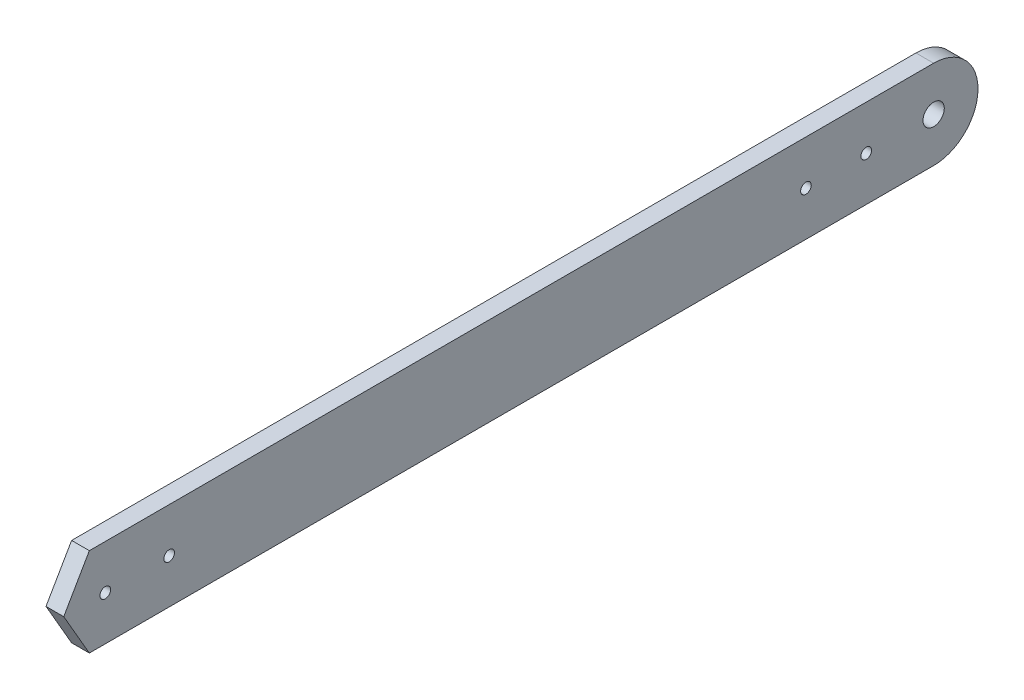
ISO-10303-21;
HEADER;
FILE_DESCRIPTION(('STEP AP214'),'2;1');
FILE_NAME('part.step','',(''),(''),'','','');
FILE_SCHEMA(('AUTOMOTIVE_DESIGN { 1 0 10303 214 1 1 1 1 }'));
ENDSEC;
DATA;
#1=APPLICATION_CONTEXT('core data for automotive mechanical design processes');
#2=APPLICATION_PROTOCOL_DEFINITION('international standard','automotive_design',2000,#1);
#3=PRODUCT_CONTEXT('',#1,'mechanical');
#4=PRODUCT('Part','Part','',(#3));
#5=PRODUCT_RELATED_PRODUCT_CATEGORY('part','',(#4));
#6=PRODUCT_DEFINITION_FORMATION('','',#4);
#7=PRODUCT_DEFINITION_CONTEXT('part definition',#1,'design');
#8=PRODUCT_DEFINITION('design','',#6,#7);
#9=PRODUCT_DEFINITION_SHAPE('','',#8);
#10=(LENGTH_UNIT() NAMED_UNIT(*) SI_UNIT(.MILLI.,.METRE.));
#11=(NAMED_UNIT(*) PLANE_ANGLE_UNIT() SI_UNIT($,.RADIAN.));
#12=(NAMED_UNIT(*) SI_UNIT($,.STERADIAN.) SOLID_ANGLE_UNIT());
#13=UNCERTAINTY_MEASURE_WITH_UNIT(LENGTH_MEASURE(1.E-05),#10,'distance_accuracy_value','');
#14=(GEOMETRIC_REPRESENTATION_CONTEXT(3) GLOBAL_UNCERTAINTY_ASSIGNED_CONTEXT((#13)) GLOBAL_UNIT_ASSIGNED_CONTEXT((#10,
#11,#12)) REPRESENTATION_CONTEXT('',''));
#15=CARTESIAN_POINT('',(0.,0.,0.));
#16=DIRECTION('',(0.,0.,1.));
#17=DIRECTION('',(1.,0.,0.));
#18=AXIS2_PLACEMENT_3D('',#15,#16,#17);
#19=CARTESIAN_POINT('',(-2.5,-12.5,258.5));
#20=DIRECTION('',(0.,1.,0.));
#21=DIRECTION('',(0.,0.,1.));
#22=AXIS2_PLACEMENT_3D('',#19,#20,#21);
#23=PLANE('',#22);
#24=DIRECTION('',(1.,0.,0.));
#25=VECTOR('',#24,1.);
#26=CARTESIAN_POINT('',(-2.5,-12.5,12.5));
#27=LINE('',#26,#25);
#28=CARTESIAN_POINT('',(-2.5,-12.5,12.5));
#29=VERTEX_POINT('',#28);
#30=CARTESIAN_POINT('',(2.5,-12.5,12.5));
#31=VERTEX_POINT('',#30);
#32=EDGE_CURVE('E100',#29,#31,#27,.T.);
#33=ORIENTED_EDGE('',*,*,#32,.T.);
#34=DIRECTION('',(0.,0.,-1.));
#35=VECTOR('',#34,1.);
#36=CARTESIAN_POINT('',(2.5,-12.5,258.5));
#37=LINE('',#36,#35);
#38=CARTESIAN_POINT('',(2.5,-12.5,250.5));
#39=VERTEX_POINT('',#38);
#40=EDGE_CURVE('E95',#39,#31,#37,.T.);
#41=ORIENTED_EDGE('',*,*,#40,.F.);
#42=DIRECTION('',(1.,0.,0.));
#43=VECTOR('',#42,1.);
#44=CARTESIAN_POINT('',(-2.5,-12.5,250.5));
#45=LINE('',#44,#43);
#46=CARTESIAN_POINT('',(-2.5,-12.5,250.5));
#47=VERTEX_POINT('',#46);
#48=EDGE_CURVE('E82',#47,#39,#45,.T.);
#49=ORIENTED_EDGE('',*,*,#48,.F.);
#50=DIRECTION('',(0.,0.,-1.));
#51=VECTOR('',#50,1.);
#52=CARTESIAN_POINT('',(-2.5,-12.5,258.5));
#53=LINE('',#52,#51);
#54=EDGE_CURVE('E101',#47,#29,#53,.T.);
#55=ORIENTED_EDGE('',*,*,#54,.T.);
#56=EDGE_LOOP('',(#33,#41,#49,#55));
#57=FACE_BOUND('',#56,.T.);
#58=ADVANCED_FACE('F37',(#57),#23,.F.);
#59=CARTESIAN_POINT('',(2.5,-12.5,258.5));
#60=DIRECTION('',(-1.,0.,0.));
#61=DIRECTION('',(0.,0.,1.));
#62=AXIS2_PLACEMENT_3D('',#59,#60,#61);
#63=PLANE('',#62);
#64=CARTESIAN_POINT('',(2.5,0.,228.));
#65=DIRECTION('',(1.,0.,0.));
#66=DIRECTION('',(0.,0.,-1.));
#67=AXIS2_PLACEMENT_3D('',#64,#65,#66);
#68=CIRCLE('',#67,1.50000000000003);
#69=CARTESIAN_POINT('',(2.5,0.,226.5));
#70=VERTEX_POINT('',#69);
#71=EDGE_CURVE('E139',#70,#70,#68,.T.);
#72=ORIENTED_EDGE('',*,*,#71,.F.);
#73=EDGE_LOOP('',(#72));
#74=FACE_BOUND('',#73,.T.);
#75=CARTESIAN_POINT('',(2.5,0.,246.));
#76=DIRECTION('',(1.,0.,0.));
#77=DIRECTION('',(0.,0.,-1.));
#78=AXIS2_PLACEMENT_3D('',#75,#76,#77);
#79=CIRCLE('',#78,1.50000000000003);
#80=CARTESIAN_POINT('',(2.5,0.,244.5));
#81=VERTEX_POINT('',#80);
#82=EDGE_CURVE('E133',#81,#81,#79,.T.);
#83=ORIENTED_EDGE('',*,*,#82,.F.);
#84=EDGE_LOOP('',(#83));
#85=FACE_BOUND('',#84,.T.);
#86=CARTESIAN_POINT('',(2.5,0.,48.5));
#87=DIRECTION('',(1.,0.,0.));
#88=DIRECTION('',(0.,0.,-1.));
#89=AXIS2_PLACEMENT_3D('',#86,#87,#88);
#90=CIRCLE('',#89,1.5);
#91=CARTESIAN_POINT('',(2.5,0.,47.));
#92=VERTEX_POINT('',#91);
#93=EDGE_CURVE('E123',#92,#92,#90,.T.);
#94=ORIENTED_EDGE('',*,*,#93,.F.);
#95=EDGE_LOOP('',(#94));
#96=FACE_BOUND('',#95,.T.);
#97=CARTESIAN_POINT('',(2.5,0.,31.5));
#98=DIRECTION('',(1.,0.,0.));
#99=DIRECTION('',(0.,0.,-1.));
#100=AXIS2_PLACEMENT_3D('',#97,#98,#99);
#101=CIRCLE('',#100,1.5);
#102=CARTESIAN_POINT('',(2.5,0.,30.));
#103=VERTEX_POINT('',#102);
#104=EDGE_CURVE('E163',#103,#103,#101,.T.);
#105=ORIENTED_EDGE('',*,*,#104,.F.);
#106=EDGE_LOOP('',(#105));
#107=FACE_BOUND('',#106,.T.);
#108=CARTESIAN_POINT('',(2.5,0.,12.5));
#109=DIRECTION('',(1.,0.,0.));
#110=DIRECTION('',(0.,0.,-1.));
#111=AXIS2_PLACEMENT_3D('',#108,#109,#110);
#112=CIRCLE('',#111,3.);
#113=CARTESIAN_POINT('',(2.5,0.,9.50000000000001));
#114=VERTEX_POINT('',#113);
#115=EDGE_CURVE('E106',#114,#114,#112,.T.);
#116=ORIENTED_EDGE('',*,*,#115,.F.);
#117=EDGE_LOOP('',(#116));
#118=FACE_BOUND('',#117,.T.);
#119=ORIENTED_EDGE('',*,*,#40,.T.);
#120=CARTESIAN_POINT('',(2.5,0.,12.5));
#121=DIRECTION('',(-1.,0.,0.));
#122=DIRECTION('',(0.,0.,-1.));
#123=AXIS2_PLACEMENT_3D('',#120,#121,#122);
#124=CIRCLE('',#123,12.5);
#125=CARTESIAN_POINT('',(2.5,12.5,12.5));
#126=VERTEX_POINT('',#125);
#127=EDGE_CURVE('E60',#126,#31,#124,.T.);
#128=ORIENTED_EDGE('',*,*,#127,.F.);
#129=DIRECTION('',(0.,0.,-1.));
#130=VECTOR('',#129,1.);
#131=CARTESIAN_POINT('',(2.5,12.5,258.5));
#132=LINE('',#131,#130);
#133=CARTESIAN_POINT('',(2.5,12.5,250.5));
#134=VERTEX_POINT('',#133);
#135=EDGE_CURVE('E11',#134,#126,#132,.T.);
#136=ORIENTED_EDGE('',*,*,#135,.F.);
#137=DIRECTION('',(0.,0.866025403784438,-0.500000000000001));
#138=VECTOR('',#137,1.);
#139=CARTESIAN_POINT('',(2.5,0.,257.71687836487));
#140=LINE('',#139,#138);
#141=CARTESIAN_POINT('',(2.5,0.,257.71687836487));
#142=VERTEX_POINT('',#141);
#143=EDGE_CURVE('E97',#142,#134,#140,.T.);
#144=ORIENTED_EDGE('',*,*,#143,.F.);
#145=DIRECTION('',(0.,0.866025403784438,0.500000000000001));
#146=VECTOR('',#145,1.);
#147=CARTESIAN_POINT('',(2.5,-12.5,250.5));
#148=LINE('',#147,#146);
#149=EDGE_CURVE('E85',#39,#142,#148,.T.);
#150=ORIENTED_EDGE('',*,*,#149,.F.);
#151=EDGE_LOOP('',(#119,#128,#136,#144,#150));
#152=FACE_BOUND('',#151,.T.);
#153=ADVANCED_FACE('F39',(#74,#85,#96,#107,#118,#152),#63,.F.);
#154=CARTESIAN_POINT('',(-2.5,12.5,258.5));
#155=DIRECTION('',(0.,-1.,0.));
#156=DIRECTION('',(0.,0.,-1.));
#157=AXIS2_PLACEMENT_3D('',#154,#155,#156);
#158=PLANE('',#157);
#159=ORIENTED_EDGE('',*,*,#135,.T.);
#160=DIRECTION('',(1.,0.,0.));
#161=VECTOR('',#160,1.);
#162=CARTESIAN_POINT('',(-2.5,12.5,12.5));
#163=LINE('',#162,#161);
#164=CARTESIAN_POINT('',(-2.5,12.5,12.5));
#165=VERTEX_POINT('',#164);
#166=EDGE_CURVE('E122',#165,#126,#163,.T.);
#167=ORIENTED_EDGE('',*,*,#166,.F.);
#168=DIRECTION('',(0.,0.,-1.));
#169=VECTOR('',#168,1.);
#170=CARTESIAN_POINT('',(-2.5,12.5,258.5));
#171=LINE('',#170,#169);
#172=CARTESIAN_POINT('',(-2.5,12.5,250.5));
#173=VERTEX_POINT('',#172);
#174=EDGE_CURVE('E45',#173,#165,#171,.T.);
#175=ORIENTED_EDGE('',*,*,#174,.F.);
#176=DIRECTION('',(1.,0.,0.));
#177=VECTOR('',#176,1.);
#178=CARTESIAN_POINT('',(-2.5,12.5,250.5));
#179=LINE('',#178,#177);
#180=EDGE_CURVE('E91',#173,#134,#179,.T.);
#181=ORIENTED_EDGE('',*,*,#180,.T.);
#182=EDGE_LOOP('',(#159,#167,#175,#181));
#183=FACE_BOUND('',#182,.T.);
#184=ADVANCED_FACE('F121',(#183),#158,.F.);
#185=CARTESIAN_POINT('',(-2.5,-12.5,258.5));
#186=DIRECTION('',(1.,0.,0.));
#187=DIRECTION('',(0.,0.,-1.));
#188=AXIS2_PLACEMENT_3D('',#185,#186,#187);
#189=PLANE('',#188);
#190=CARTESIAN_POINT('',(-2.5,0.,228.));
#191=DIRECTION('',(1.,0.,0.));
#192=DIRECTION('',(0.,0.,-1.));
#193=AXIS2_PLACEMENT_3D('',#190,#191,#192);
#194=CIRCLE('',#193,1.50000000000003);
#195=CARTESIAN_POINT('',(-2.5,0.,226.5));
#196=VERTEX_POINT('',#195);
#197=EDGE_CURVE('E98',#196,#196,#194,.T.);
#198=ORIENTED_EDGE('',*,*,#197,.T.);
#199=EDGE_LOOP('',(#198));
#200=FACE_BOUND('',#199,.T.);
#201=CARTESIAN_POINT('',(-2.5,0.,246.));
#202=DIRECTION('',(1.,0.,0.));
#203=DIRECTION('',(0.,0.,-1.));
#204=AXIS2_PLACEMENT_3D('',#201,#202,#203);
#205=CIRCLE('',#204,1.50000000000003);
#206=CARTESIAN_POINT('',(-2.5,0.,244.5));
#207=VERTEX_POINT('',#206);
#208=EDGE_CURVE('E136',#207,#207,#205,.T.);
#209=ORIENTED_EDGE('',*,*,#208,.T.);
#210=EDGE_LOOP('',(#209));
#211=FACE_BOUND('',#210,.T.);
#212=CARTESIAN_POINT('',(-2.5,0.,48.5));
#213=DIRECTION('',(1.,0.,0.));
#214=DIRECTION('',(0.,0.,-1.));
#215=AXIS2_PLACEMENT_3D('',#212,#213,#214);
#216=CIRCLE('',#215,1.5);
#217=CARTESIAN_POINT('',(-2.5,0.,47.));
#218=VERTEX_POINT('',#217);
#219=EDGE_CURVE('E127',#218,#218,#216,.T.);
#220=ORIENTED_EDGE('',*,*,#219,.T.);
#221=EDGE_LOOP('',(#220));
#222=FACE_BOUND('',#221,.T.);
#223=CARTESIAN_POINT('',(-2.5,0.,31.5));
#224=DIRECTION('',(1.,0.,0.));
#225=DIRECTION('',(0.,0.,-1.));
#226=AXIS2_PLACEMENT_3D('',#223,#224,#225);
#227=CIRCLE('',#226,1.5);
#228=CARTESIAN_POINT('',(-2.5,0.,30.));
#229=VERTEX_POINT('',#228);
#230=EDGE_CURVE('E302',#229,#229,#227,.T.);
#231=ORIENTED_EDGE('',*,*,#230,.T.);
#232=EDGE_LOOP('',(#231));
#233=FACE_BOUND('',#232,.T.);
#234=CARTESIAN_POINT('',(-2.5,0.,12.5));
#235=DIRECTION('',(1.,0.,0.));
#236=DIRECTION('',(0.,0.,-1.));
#237=AXIS2_PLACEMENT_3D('',#234,#235,#236);
#238=CIRCLE('',#237,3.);
#239=CARTESIAN_POINT('',(-2.5,0.,9.50000000000001));
#240=VERTEX_POINT('',#239);
#241=EDGE_CURVE('E102',#240,#240,#238,.T.);
#242=ORIENTED_EDGE('',*,*,#241,.T.);
#243=EDGE_LOOP('',(#242));
#244=FACE_BOUND('',#243,.T.);
#245=ORIENTED_EDGE('',*,*,#174,.T.);
#246=CARTESIAN_POINT('',(-2.5,0.,12.5));
#247=DIRECTION('',(-1.,0.,0.));
#248=DIRECTION('',(0.,0.,-1.));
#249=AXIS2_PLACEMENT_3D('',#246,#247,#248);
#250=CIRCLE('',#249,12.5);
#251=EDGE_CURVE('E115',#165,#29,#250,.T.);
#252=ORIENTED_EDGE('',*,*,#251,.T.);
#253=ORIENTED_EDGE('',*,*,#54,.F.);
#254=DIRECTION('',(0.,0.866025403784438,0.500000000000001));
#255=VECTOR('',#254,1.);
#256=CARTESIAN_POINT('',(-2.5,-12.5,250.5));
#257=LINE('',#256,#255);
#258=CARTESIAN_POINT('',(-2.5,0.,257.71687836487));
#259=VERTEX_POINT('',#258);
#260=EDGE_CURVE('E52',#47,#259,#257,.T.);
#261=ORIENTED_EDGE('',*,*,#260,.T.);
#262=DIRECTION('',(0.,0.866025403784438,-0.500000000000001));
#263=VECTOR('',#262,1.);
#264=CARTESIAN_POINT('',(-2.5,0.,257.71687836487));
#265=LINE('',#264,#263);
#266=EDGE_CURVE('E117',#259,#173,#265,.T.);
#267=ORIENTED_EDGE('',*,*,#266,.T.);
#268=EDGE_LOOP('',(#245,#252,#253,#261,#267));
#269=FACE_BOUND('',#268,.T.);
#270=ADVANCED_FACE('F114',(#200,#211,#222,#233,#244,#269),#189,.F.);
#271=CARTESIAN_POINT('',(-2.5,-12.5,250.5));
#272=DIRECTION('',(0.,0.500000000000001,-0.866025403784438));
#273=DIRECTION('',(0.,0.866025403784438,0.500000000000001));
#274=AXIS2_PLACEMENT_3D('',#271,#272,#273);
#275=PLANE('',#274);
#276=ORIENTED_EDGE('',*,*,#149,.T.);
#277=DIRECTION('',(1.,0.,0.));
#278=VECTOR('',#277,1.);
#279=CARTESIAN_POINT('',(-2.5,0.,257.71687836487));
#280=LINE('',#279,#278);
#281=EDGE_CURVE('E307',#259,#142,#280,.T.);
#282=ORIENTED_EDGE('',*,*,#281,.F.);
#283=ORIENTED_EDGE('',*,*,#260,.F.);
#284=ORIENTED_EDGE('',*,*,#48,.T.);
#285=EDGE_LOOP('',(#276,#282,#283,#284));
#286=FACE_BOUND('',#285,.T.);
#287=ADVANCED_FACE('F84',(#286),#275,.F.);
#288=CARTESIAN_POINT('',(-2.5,0.,257.71687836487));
#289=DIRECTION('',(0.,-0.500000000000001,-0.866025403784438));
#290=DIRECTION('',(0.,0.866025403784438,-0.500000000000001));
#291=AXIS2_PLACEMENT_3D('',#288,#289,#290);
#292=PLANE('',#291);
#293=ORIENTED_EDGE('',*,*,#143,.T.);
#294=ORIENTED_EDGE('',*,*,#180,.F.);
#295=ORIENTED_EDGE('',*,*,#266,.F.);
#296=ORIENTED_EDGE('',*,*,#281,.T.);
#297=EDGE_LOOP('',(#293,#294,#295,#296));
#298=FACE_BOUND('',#297,.T.);
#299=ADVANCED_FACE('F180',(#298),#292,.F.);
#300=CARTESIAN_POINT('',(-2.5,0.,12.5));
#301=DIRECTION('',(1.,0.,0.));
#302=DIRECTION('',(0.,0.,-1.));
#303=AXIS2_PLACEMENT_3D('',#300,#301,#302);
#304=CYLINDRICAL_SURFACE('',#303,12.5);
#305=ORIENTED_EDGE('',*,*,#127,.T.);
#306=ORIENTED_EDGE('',*,*,#32,.F.);
#307=ORIENTED_EDGE('',*,*,#251,.F.);
#308=ORIENTED_EDGE('',*,*,#166,.T.);
#309=EDGE_LOOP('',(#305,#306,#307,#308));
#310=FACE_BOUND('',#309,.T.);
#311=ADVANCED_FACE('F170',(#310),#304,.T.);
#312=CARTESIAN_POINT('',(-2.5,0.,12.5));
#313=DIRECTION('',(1.,0.,0.));
#314=DIRECTION('',(0.,0.,-1.));
#315=AXIS2_PLACEMENT_3D('',#312,#313,#314);
#316=CYLINDRICAL_SURFACE('',#315,3.);
#317=ORIENTED_EDGE('',*,*,#241,.F.);
#318=EDGE_LOOP('',(#317));
#319=FACE_BOUND('',#318,.T.);
#320=ORIENTED_EDGE('',*,*,#115,.T.);
#321=EDGE_LOOP('',(#320));
#322=FACE_BOUND('',#321,.T.);
#323=ADVANCED_FACE('F167',(#319,#322),#316,.F.);
#324=CARTESIAN_POINT('',(-2.5,0.,31.5));
#325=DIRECTION('',(1.,0.,0.));
#326=DIRECTION('',(0.,0.,-1.));
#327=AXIS2_PLACEMENT_3D('',#324,#325,#326);
#328=CYLINDRICAL_SURFACE('',#327,1.5);
#329=ORIENTED_EDGE('',*,*,#230,.F.);
#330=EDGE_LOOP('',(#329));
#331=FACE_BOUND('',#330,.T.);
#332=ORIENTED_EDGE('',*,*,#104,.T.);
#333=EDGE_LOOP('',(#332));
#334=FACE_BOUND('',#333,.T.);
#335=ADVANCED_FACE('F169',(#331,#334),#328,.F.);
#336=CARTESIAN_POINT('',(-2.5,0.,48.5));
#337=DIRECTION('',(1.,0.,0.));
#338=DIRECTION('',(0.,0.,-1.));
#339=AXIS2_PLACEMENT_3D('',#336,#337,#338);
#340=CYLINDRICAL_SURFACE('',#339,1.5);
#341=ORIENTED_EDGE('',*,*,#219,.F.);
#342=EDGE_LOOP('',(#341));
#343=FACE_BOUND('',#342,.T.);
#344=ORIENTED_EDGE('',*,*,#93,.T.);
#345=EDGE_LOOP('',(#344));
#346=FACE_BOUND('',#345,.T.);
#347=ADVANCED_FACE('F177',(#343,#346),#340,.F.);
#348=CARTESIAN_POINT('',(-2.5,0.,246.));
#349=DIRECTION('',(1.,0.,0.));
#350=DIRECTION('',(0.,0.,-1.));
#351=AXIS2_PLACEMENT_3D('',#348,#349,#350);
#352=CYLINDRICAL_SURFACE('',#351,1.50000000000003);
#353=ORIENTED_EDGE('',*,*,#208,.F.);
#354=EDGE_LOOP('',(#353));
#355=FACE_BOUND('',#354,.T.);
#356=ORIENTED_EDGE('',*,*,#82,.T.);
#357=EDGE_LOOP('',(#356));
#358=FACE_BOUND('',#357,.T.);
#359=ADVANCED_FACE('F150',(#355,#358),#352,.F.);
#360=CARTESIAN_POINT('',(-2.5,0.,228.));
#361=DIRECTION('',(1.,0.,0.));
#362=DIRECTION('',(0.,0.,-1.));
#363=AXIS2_PLACEMENT_3D('',#360,#361,#362);
#364=CYLINDRICAL_SURFACE('',#363,1.50000000000003);
#365=ORIENTED_EDGE('',*,*,#197,.F.);
#366=EDGE_LOOP('',(#365));
#367=FACE_BOUND('',#366,.T.);
#368=ORIENTED_EDGE('',*,*,#71,.T.);
#369=EDGE_LOOP('',(#368));
#370=FACE_BOUND('',#369,.T.);
#371=ADVANCED_FACE('F147',(#367,#370),#364,.F.);
#372=CLOSED_SHELL('',(#58,#153,#184,#270,#287,#299,#311,#323,#335,#347,#359,#371));
#373=MANIFOLD_SOLID_BREP('B2',#372);
#374=ADVANCED_BREP_SHAPE_REPRESENTATION('',(#18,#373),#14);
#375=SHAPE_DEFINITION_REPRESENTATION(#9,#374);
ENDSEC;
END-ISO-10303-21;
